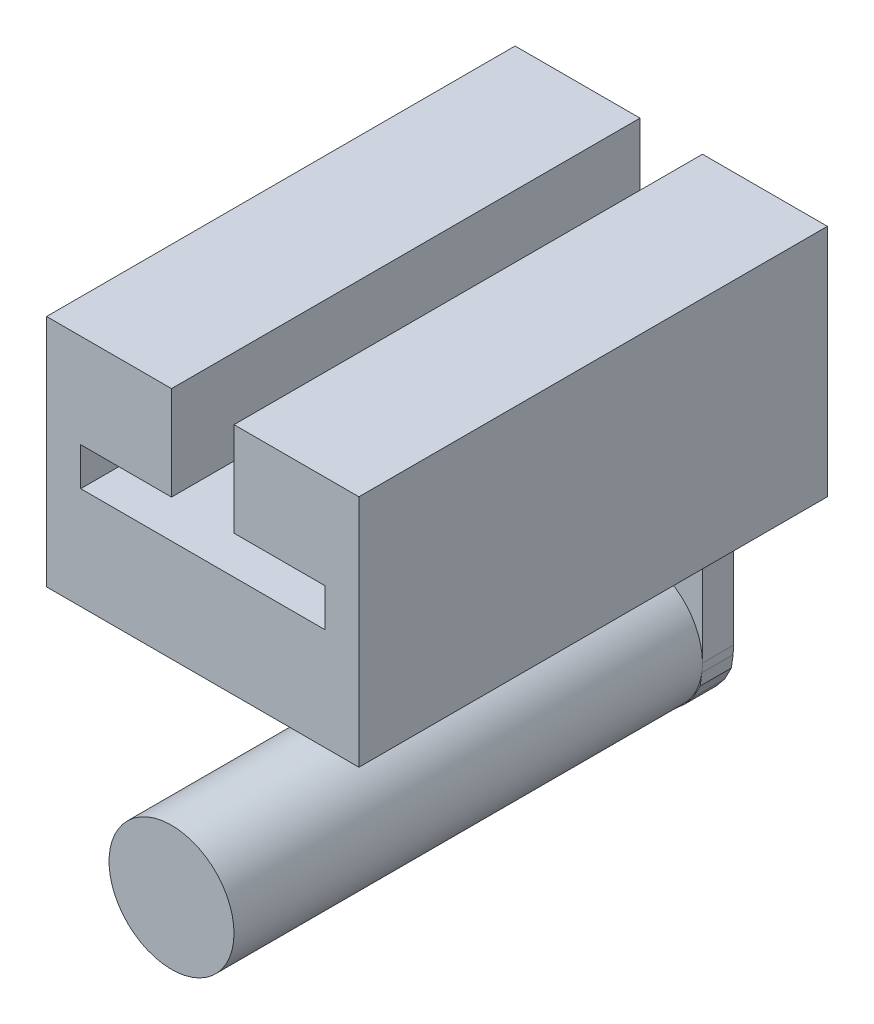
ISO-10303-21;
HEADER;
FILE_DESCRIPTION(('STEP AP214'),'2;1');
FILE_NAME('part.step','',(''),(''),'','','');
FILE_SCHEMA(('AUTOMOTIVE_DESIGN { 1 0 10303 214 1 1 1 1 }'));
ENDSEC;
DATA;
#1=APPLICATION_CONTEXT('core data for automotive mechanical design processes');
#2=APPLICATION_PROTOCOL_DEFINITION('international standard','automotive_design',2000,#1);
#3=PRODUCT_CONTEXT('',#1,'mechanical');
#4=PRODUCT('Part','Part','',(#3));
#5=PRODUCT_RELATED_PRODUCT_CATEGORY('part','',(#4));
#6=PRODUCT_DEFINITION_FORMATION('','',#4);
#7=PRODUCT_DEFINITION_CONTEXT('part definition',#1,'design');
#8=PRODUCT_DEFINITION('design','',#6,#7);
#9=PRODUCT_DEFINITION_SHAPE('','',#8);
#10=(LENGTH_UNIT() NAMED_UNIT(*) SI_UNIT(.MILLI.,.METRE.));
#11=(NAMED_UNIT(*) PLANE_ANGLE_UNIT() SI_UNIT($,.RADIAN.));
#12=(NAMED_UNIT(*) SI_UNIT($,.STERADIAN.) SOLID_ANGLE_UNIT());
#13=UNCERTAINTY_MEASURE_WITH_UNIT(LENGTH_MEASURE(1.E-05),#10,'distance_accuracy_value','');
#14=(GEOMETRIC_REPRESENTATION_CONTEXT(3) GLOBAL_UNCERTAINTY_ASSIGNED_CONTEXT((#13)) GLOBAL_UNIT_ASSIGNED_CONTEXT((#10,
#11,#12)) REPRESENTATION_CONTEXT('',''));
#15=CARTESIAN_POINT('',(0.,0.,0.));
#16=DIRECTION('',(0.,0.,1.));
#17=DIRECTION('',(1.,0.,0.));
#18=AXIS2_PLACEMENT_3D('',#15,#16,#17);
#19=CARTESIAN_POINT('',(0.,-38.1,0.));
#20=DIRECTION('',(0.,1.,0.));
#21=DIRECTION('',(0.,0.,1.));
#22=AXIS2_PLACEMENT_3D('',#19,#20,#21);
#23=PLANE('',#22);
#24=DIRECTION('',(0.,0.,1.));
#25=VECTOR('',#24,1.);
#26=CARTESIAN_POINT('',(-14.3445373438355,-38.1,-38.101025));
#27=LINE('',#26,#25);
#28=CARTESIAN_POINT('',(-14.3445373438355,-38.1,-38.1));
#29=VERTEX_POINT('',#28);
#30=CARTESIAN_POINT('',(-14.3445373438355,-38.1,-35.56));
#31=VERTEX_POINT('',#30);
#32=EDGE_CURVE('E246',#29,#31,#27,.T.);
#33=ORIENTED_EDGE('',*,*,#32,.F.);
#34=DIRECTION('',(1.,0.,0.));
#35=VECTOR('',#34,1.);
#36=CARTESIAN_POINT('',(-17.78,-38.1,-38.1));
#37=LINE('',#36,#35);
#38=CARTESIAN_POINT('',(-11.0554626561645,-38.1,-38.1));
#39=VERTEX_POINT('',#38);
#40=EDGE_CURVE('E259',#29,#39,#37,.T.);
#41=ORIENTED_EDGE('',*,*,#40,.T.);
#42=DIRECTION('',(0.,0.,1.));
#43=VECTOR('',#42,1.);
#44=CARTESIAN_POINT('',(-11.0554626561645,-38.1,-38.101));
#45=LINE('',#44,#43);
#46=CARTESIAN_POINT('',(-11.0554626561645,-38.1,-35.56));
#47=VERTEX_POINT('',#46);
#48=EDGE_CURVE('E405',#39,#47,#45,.T.);
#49=ORIENTED_EDGE('',*,*,#48,.T.);
#50=DIRECTION('',(-1.,0.,0.));
#51=VECTOR('',#50,1.);
#52=CARTESIAN_POINT('',(-17.78,-38.1,-35.56));
#53=LINE('',#52,#51);
#54=EDGE_CURVE('E265',#47,#31,#53,.T.);
#55=ORIENTED_EDGE('',*,*,#54,.T.);
#56=EDGE_LOOP('',(#33,#41,#49,#55));
#57=FACE_BOUND('',#56,.T.);
#58=ADVANCED_FACE('F47',(#57),#23,.F.);
#59=CARTESIAN_POINT('',(-25.4,0.,-38.1));
#60=DIRECTION('',(0.,0.,-1.));
#61=DIRECTION('',(-1.,0.,0.));
#62=AXIS2_PLACEMENT_3D('',#59,#60,#61);
#63=PLANE('',#62);
#64=DIRECTION('',(-0.370631758396947,0.928779898397671,0.));
#65=VECTOR('',#64,1.);
#66=CARTESIAN_POINT('',(-17.5056762409056,-34.9403341471908,-38.1));
#67=LINE('',#66,#65);
#68=CARTESIAN_POINT('',(-17.2038154332679,-35.6967783641156,-38.1));
#69=VERTEX_POINT('',#68);
#70=CARTESIAN_POINT('',(-17.6791524726972,-34.5056136104654,-38.1));
#71=VERTEX_POINT('',#70);
#72=EDGE_CURVE('E712',#69,#71,#67,.T.);
#73=ORIENTED_EDGE('',*,*,#72,.T.);
#74=DIRECTION('',(-0.0829171097609056,0.996556447427289,0.));
#75=VECTOR('',#74,1.);
#76=CARTESIAN_POINT('',(-17.6791524726972,-34.5056136104654,-38.1));
#77=LINE('',#76,#75);
#78=CARTESIAN_POINT('',(-17.78,-33.2935567282313,-38.1));
#79=VERTEX_POINT('',#78);
#80=EDGE_CURVE('E679',#71,#79,#77,.T.);
#81=ORIENTED_EDGE('',*,*,#80,.T.);
#82=DIRECTION('',(0.,1.,0.));
#83=VECTOR('',#82,1.);
#84=CARTESIAN_POINT('',(-17.78,-38.1,-38.1));
#85=LINE('',#84,#83);
#86=CARTESIAN_POINT('',(-17.78,-19.05,-38.1));
#87=VERTEX_POINT('',#86);
#88=EDGE_CURVE('E522',#79,#87,#85,.T.);
#89=ORIENTED_EDGE('',*,*,#88,.T.);
#90=DIRECTION('',(1.,0.,0.));
#91=VECTOR('',#90,1.);
#92=CARTESIAN_POINT('',(-25.4,-19.05,-38.1));
#93=LINE('',#92,#91);
#94=CARTESIAN_POINT('',(-25.4,-19.05,-38.1));
#95=VERTEX_POINT('',#94);
#96=EDGE_CURVE('E511',#95,#87,#93,.T.);
#97=ORIENTED_EDGE('',*,*,#96,.F.);
#98=DIRECTION('',(0.,1.,0.));
#99=VECTOR('',#98,1.);
#100=CARTESIAN_POINT('',(-25.4,0.,-38.1));
#101=LINE('',#100,#99);
#102=CARTESIAN_POINT('',(-25.4,0.,-38.1));
#103=VERTEX_POINT('',#102);
#104=EDGE_CURVE('E619',#95,#103,#101,.T.);
#105=ORIENTED_EDGE('',*,*,#104,.T.);
#106=DIRECTION('',(1.,0.,0.));
#107=VECTOR('',#106,1.);
#108=CARTESIAN_POINT('',(-25.4,0.,-38.1));
#109=LINE('',#108,#107);
#110=CARTESIAN_POINT('',(-15.24,0.,-38.1));
#111=VERTEX_POINT('',#110);
#112=EDGE_CURVE('E643',#103,#111,#109,.T.);
#113=ORIENTED_EDGE('',*,*,#112,.T.);
#114=DIRECTION('',(0.,-1.,0.));
#115=VECTOR('',#114,1.);
#116=CARTESIAN_POINT('',(-15.24,0.,-38.1));
#117=LINE('',#116,#115);
#118=CARTESIAN_POINT('',(-15.24,-7.64301163766851,-38.1));
#119=VERTEX_POINT('',#118);
#120=EDGE_CURVE('E533',#111,#119,#117,.T.);
#121=ORIENTED_EDGE('',*,*,#120,.T.);
#122=DIRECTION('',(-1.,0.,0.));
#123=VECTOR('',#122,1.);
#124=CARTESIAN_POINT('',(-15.24,-7.64301163766851,-38.1));
#125=LINE('',#124,#123);
#126=CARTESIAN_POINT('',(-22.6260142007384,-7.64301163766851,-38.1));
#127=VERTEX_POINT('',#126);
#128=EDGE_CURVE('E532',#119,#127,#125,.T.);
#129=ORIENTED_EDGE('',*,*,#128,.T.);
#130=DIRECTION('',(0.,-1.,0.));
#131=VECTOR('',#130,1.);
#132=CARTESIAN_POINT('',(-22.6260142007384,-7.64301163766851,-38.1));
#133=LINE('',#132,#131);
#134=CARTESIAN_POINT('',(-22.6260142007384,-10.7418116376685,-38.1));
#135=VERTEX_POINT('',#134);
#136=EDGE_CURVE('E539',#127,#135,#133,.T.);
#137=ORIENTED_EDGE('',*,*,#136,.T.);
#138=DIRECTION('',(1.,0.,0.));
#139=VECTOR('',#138,1.);
#140=CARTESIAN_POINT('',(-2.77398579926159,-10.7418116376685,-38.1));
#141=LINE('',#140,#139);
#142=CARTESIAN_POINT('',(-2.77398579926159,-10.7418116376685,-38.1));
#143=VERTEX_POINT('',#142);
#144=EDGE_CURVE('E542',#135,#143,#141,.T.);
#145=ORIENTED_EDGE('',*,*,#144,.T.);
#146=DIRECTION('',(0.,1.,0.));
#147=VECTOR('',#146,1.);
#148=CARTESIAN_POINT('',(-2.77398579926159,-7.6430116376685,-38.1));
#149=LINE('',#148,#147);
#150=CARTESIAN_POINT('',(-2.77398579926159,-7.6430116376685,-38.1));
#151=VERTEX_POINT('',#150);
#152=EDGE_CURVE('E547',#143,#151,#149,.T.);
#153=ORIENTED_EDGE('',*,*,#152,.T.);
#154=DIRECTION('',(-1.,0.,0.));
#155=VECTOR('',#154,1.);
#156=CARTESIAN_POINT('',(-10.16,-7.6430116376685,-38.1));
#157=LINE('',#156,#155);
#158=CARTESIAN_POINT('',(-10.16,-7.6430116376685,-38.1));
#159=VERTEX_POINT('',#158);
#160=EDGE_CURVE('E555',#151,#159,#157,.T.);
#161=ORIENTED_EDGE('',*,*,#160,.T.);
#162=DIRECTION('',(0.,1.,0.));
#163=VECTOR('',#162,1.);
#164=CARTESIAN_POINT('',(-10.16,0.,-38.1));
#165=LINE('',#164,#163);
#166=CARTESIAN_POINT('',(-10.16,0.,-38.1));
#167=VERTEX_POINT('',#166);
#168=EDGE_CURVE('E557',#159,#167,#165,.T.);
#169=ORIENTED_EDGE('',*,*,#168,.T.);
#170=CARTESIAN_POINT('',(0.,0.,-38.1));
#171=VERTEX_POINT('',#170);
#172=EDGE_CURVE('E644',#167,#171,#109,.T.);
#173=ORIENTED_EDGE('',*,*,#172,.T.);
#174=DIRECTION('',(0.,1.,0.));
#175=VECTOR('',#174,1.);
#176=CARTESIAN_POINT('',(0.,0.,-38.1));
#177=LINE('',#176,#175);
#178=CARTESIAN_POINT('',(0.,-19.05,-38.1));
#179=VERTEX_POINT('',#178);
#180=EDGE_CURVE('E632',#179,#171,#177,.T.);
#181=ORIENTED_EDGE('',*,*,#180,.F.);
#182=CARTESIAN_POINT('',(-7.62,-19.05,-38.1));
#183=VERTEX_POINT('',#182);
#184=EDGE_CURVE('E646',#183,#179,#93,.T.);
#185=ORIENTED_EDGE('',*,*,#184,.F.);
#186=DIRECTION('',(0.,1.,0.));
#187=VECTOR('',#186,1.);
#188=CARTESIAN_POINT('',(-7.62,-38.1,-38.1));
#189=LINE('',#188,#187);
#190=CARTESIAN_POINT('',(-7.62,-33.2935567282313,-38.1));
#191=VERTEX_POINT('',#190);
#192=EDGE_CURVE('E516',#191,#183,#189,.T.);
#193=ORIENTED_EDGE('',*,*,#192,.F.);
#194=DIRECTION('',(-0.0702766361286988,-0.997527540679672,0.));
#195=VECTOR('',#194,1.);
#196=CARTESIAN_POINT('',(-7.61999999999999,-33.2935567282313,-38.1));
#197=LINE('',#196,#195);
#198=CARTESIAN_POINT('',(-7.67017826474934,-34.005801989079,-38.1));
#199=VERTEX_POINT('',#198);
#200=EDGE_CURVE('E986',#191,#199,#197,.T.);
#201=ORIENTED_EDGE('',*,*,#200,.T.);
#202=DIRECTION('',(-0.136612503361658,-0.990624562548931,0.));
#203=VECTOR('',#202,1.);
#204=CARTESIAN_POINT('',(-7.67017826474934,-34.005801989079,-38.1));
#205=LINE('',#204,#203);
#206=CARTESIAN_POINT('',(-7.80923888003215,-35.0141786588019,-38.1));
#207=VERTEX_POINT('',#206);
#208=EDGE_CURVE('E393',#199,#207,#205,.T.);
#209=ORIENTED_EDGE('',*,*,#208,.T.);
#210=DIRECTION('',(-0.461415650910825,-0.887184082980832,0.));
#211=VECTOR('',#210,1.);
#212=CARTESIAN_POINT('',(-7.80923888003215,-35.0141786588019,-38.1));
#213=LINE('',#212,#211);
#214=CARTESIAN_POINT('',(-8.35973167226811,-36.0726352631744,-38.1));
#215=VERTEX_POINT('',#214);
#216=EDGE_CURVE('E326',#207,#215,#213,.T.);
#217=ORIENTED_EDGE('',*,*,#216,.T.);
#218=DIRECTION('',(-0.635711496565143,-0.771926740782379,0.));
#219=VECTOR('',#218,1.);
#220=CARTESIAN_POINT('',(-8.35973167226811,-36.0726352631744,-38.1));
#221=LINE('',#220,#219);
#222=CARTESIAN_POINT('',(-9.02180364123595,-36.8765707904224,-38.1));
#223=VERTEX_POINT('',#222);
#224=EDGE_CURVE('E1028',#215,#223,#221,.T.);
#225=ORIENTED_EDGE('',*,*,#224,.T.);
#226=DIRECTION('',(-0.739417062071894,-0.673247657490889,0.));
#227=VECTOR('',#226,1.);
#228=CARTESIAN_POINT('',(-9.02180364123595,-36.8765707904224,-38.1));
#229=LINE('',#228,#227);
#230=CARTESIAN_POINT('',(-9.85741699767928,-37.6374062696812,-38.1));
#231=VERTEX_POINT('',#230);
#232=EDGE_CURVE('E1029',#223,#231,#229,.T.);
#233=ORIENTED_EDGE('',*,*,#232,.T.);
#234=DIRECTION('',(-0.932873385373654,-0.360204451473741,0.));
#235=VECTOR('',#234,1.);
#236=CARTESIAN_POINT('',(-9.85741699767928,-37.6374062696812,-38.1));
#237=LINE('',#236,#235);
#238=EDGE_CURVE('E271',#231,#39,#237,.T.);
#239=ORIENTED_EDGE('',*,*,#238,.T.);
#240=ORIENTED_EDGE('',*,*,#40,.F.);
#241=DIRECTION('',(-0.955155109451087,0.296105921739977,0.));
#242=VECTOR('',#241,1.);
#243=CARTESIAN_POINT('',(-14.3445373438355,-38.1,-38.1));
#244=LINE('',#243,#242);
#245=CARTESIAN_POINT('',(-15.7622179131125,-37.6605073903234,-38.1));
#246=VERTEX_POINT('',#245);
#247=EDGE_CURVE('E241',#29,#246,#244,.T.);
#248=ORIENTED_EDGE('',*,*,#247,.T.);
#249=DIRECTION('',(-0.617078696406372,0.786901443918749,0.));
#250=VECTOR('',#249,1.);
#251=CARTESIAN_POINT('',(-15.7622179131125,-37.6605073903234,-38.1));
#252=LINE('',#251,#250);
#253=CARTESIAN_POINT('',(-16.7477395777562,-36.4037658670175,-38.1));
#254=VERTEX_POINT('',#253);
#255=EDGE_CURVE('E255',#246,#254,#252,.T.);
#256=ORIENTED_EDGE('',*,*,#255,.T.);
#257=DIRECTION('',(-0.542089006613399,0.840321074892745,0.));
#258=VECTOR('',#257,1.);
#259=CARTESIAN_POINT('',(-16.7477395777562,-36.4037658670175,-38.1));
#260=LINE('',#259,#258);
#261=EDGE_CURVE('E717',#254,#69,#260,.T.);
#262=ORIENTED_EDGE('',*,*,#261,.T.);
#263=EDGE_LOOP('',(#73,#81,#89,#97,#105,#113,#121,#129,#137,#145,#153,#161,#169,#173,#181,#185,
#193,#201,#209,#217,#225,#233,#239,#240,#248,#256,#262));
#264=FACE_BOUND('',#263,.T.);
#265=ADVANCED_FACE('F267',(#264),#63,.T.);
#266=CARTESIAN_POINT('',(-17.78,-38.1,-35.56));
#267=DIRECTION('',(0.,0.,-1.));
#268=DIRECTION('',(-1.,0.,0.));
#269=AXIS2_PLACEMENT_3D('',#266,#267,#268);
#270=PLANE('',#269);
#271=DIRECTION('',(-0.955155109451088,0.296105921739977,0.));
#272=VECTOR('',#271,1.);
#273=CARTESIAN_POINT('',(-14.3445373438355,-38.1,-35.56));
#274=LINE('',#273,#272);
#275=CARTESIAN_POINT('',(-15.7622179131125,-37.6605073903234,-35.56));
#276=VERTEX_POINT('',#275);
#277=EDGE_CURVE('E68',#31,#276,#274,.T.);
#278=ORIENTED_EDGE('',*,*,#277,.F.);
#279=CARTESIAN_POINT('',(-12.7,-33.2935567282313,-35.56));
#280=DIRECTION('',(0.,0.,1.));
#281=DIRECTION('',(1.,0.,0.));
#282=AXIS2_PLACEMENT_3D('',#279,#280,#281);
#283=CIRCLE('',#282,5.08);
#284=CARTESIAN_POINT('',(-17.3191428574413,-35.4077750855798,-35.56));
#285=VERTEX_POINT('',#284);
#286=EDGE_CURVE('E52',#285,#31,#283,.T.);
#287=ORIENTED_EDGE('',*,*,#286,.F.);
#288=DIRECTION('',(-0.370631758396947,0.928779898397671,0.));
#289=VECTOR('',#288,1.);
#290=CARTESIAN_POINT('',(-17.5056762409056,-34.9403341471908,-35.56));
#291=LINE('',#290,#289);
#292=CARTESIAN_POINT('',(-17.2038154332679,-35.6967783641156,-35.56));
#293=VERTEX_POINT('',#292);
#294=EDGE_CURVE('E312',#293,#285,#291,.T.);
#295=ORIENTED_EDGE('',*,*,#294,.F.);
#296=DIRECTION('',(-0.542089006613399,0.840321074892745,0.));
#297=VECTOR('',#296,1.);
#298=CARTESIAN_POINT('',(-16.7477395777562,-36.4037658670175,-35.56));
#299=LINE('',#298,#297);
#300=CARTESIAN_POINT('',(-16.7477395777562,-36.4037658670175,-35.56));
#301=VERTEX_POINT('',#300);
#302=EDGE_CURVE('E698',#301,#293,#299,.T.);
#303=ORIENTED_EDGE('',*,*,#302,.F.);
#304=DIRECTION('',(-0.617078696406372,0.786901443918749,0.));
#305=VECTOR('',#304,1.);
#306=CARTESIAN_POINT('',(-15.7622179131125,-37.6605073903234,-35.56));
#307=LINE('',#306,#305);
#308=EDGE_CURVE('E697',#276,#301,#307,.T.);
#309=ORIENTED_EDGE('',*,*,#308,.F.);
#310=EDGE_LOOP('',(#278,#287,#295,#303,#309));
#311=FACE_BOUND('',#310,.T.);
#312=ADVANCED_FACE('F453',(#311),#270,.F.);
#313=DIRECTION('',(-0.0829171097609056,0.996556447427289,0.));
#314=VECTOR('',#313,1.);
#315=CARTESIAN_POINT('',(-17.6791524726972,-34.5056136104654,-35.56));
#316=LINE('',#315,#314);
#317=CARTESIAN_POINT('',(-17.6791524726972,-34.5056136104654,-35.56));
#318=VERTEX_POINT('',#317);
#319=CARTESIAN_POINT('',(-17.7101474895544,-34.1330935844275,-35.56));
#320=VERTEX_POINT('',#319);
#321=EDGE_CURVE('E706',#318,#320,#316,.T.);
#322=ORIENTED_EDGE('',*,*,#321,.F.);
#323=CARTESIAN_POINT('',(-17.5056762409056,-34.9403341471908,-35.56));
#324=VERTEX_POINT('',#323);
#325=EDGE_CURVE('E315',#324,#318,#291,.T.);
#326=ORIENTED_EDGE('',*,*,#325,.F.);
#327=EDGE_CURVE('E392',#320,#324,#283,.T.);
#328=ORIENTED_EDGE('',*,*,#327,.F.);
#329=EDGE_LOOP('',(#322,#326,#328));
#330=FACE_BOUND('',#329,.T.);
#331=ADVANCED_FACE('F457',(#330),#270,.F.);
#332=CARTESIAN_POINT('',(-7.62,-38.1,-38.1));
#333=DIRECTION('',(-1.,0.,0.));
#334=DIRECTION('',(0.,0.,1.));
#335=AXIS2_PLACEMENT_3D('',#332,#333,#334);
#336=PLANE('',#335);
#337=DIRECTION('',(0.,0.,1.));
#338=VECTOR('',#337,1.);
#339=CARTESIAN_POINT('',(-7.61999999999999,-33.2935567282313,-38.101));
#340=LINE('',#339,#338);
#341=CARTESIAN_POINT('',(-7.61999999999999,-33.2935567282313,-35.56));
#342=VERTEX_POINT('',#341);
#343=EDGE_CURVE('E400',#191,#342,#340,.T.);
#344=ORIENTED_EDGE('',*,*,#343,.F.);
#345=ORIENTED_EDGE('',*,*,#192,.T.);
#346=DIRECTION('',(0.,0.,1.));
#347=VECTOR('',#346,1.);
#348=CARTESIAN_POINT('',(-7.62,-19.05,-38.1));
#349=LINE('',#348,#347);
#350=CARTESIAN_POINT('',(-7.62,-19.05,-35.56));
#351=VERTEX_POINT('',#350);
#352=EDGE_CURVE('E278',#183,#351,#349,.T.);
#353=ORIENTED_EDGE('',*,*,#352,.T.);
#354=DIRECTION('',(0.,1.,0.));
#355=VECTOR('',#354,1.);
#356=CARTESIAN_POINT('',(-7.62,-38.1,-35.56));
#357=LINE('',#356,#355);
#358=EDGE_CURVE('E520',#342,#351,#357,.T.);
#359=ORIENTED_EDGE('',*,*,#358,.F.);
#360=EDGE_LOOP('',(#344,#345,#353,#359));
#361=FACE_BOUND('',#360,.T.);
#362=ADVANCED_FACE('F452',(#361),#336,.F.);
#363=DIRECTION('',(-0.932873385373654,-0.360204451473741,0.));
#364=VECTOR('',#363,1.);
#365=CARTESIAN_POINT('',(-9.85741699767928,-37.6374062696812,-35.56));
#366=LINE('',#365,#364);
#367=CARTESIAN_POINT('',(-9.85741699767928,-37.6374062696812,-35.56));
#368=VERTEX_POINT('',#367);
#369=CARTESIAN_POINT('',(-10.6876173534133,-37.9579662389536,-35.56));
#370=VERTEX_POINT('',#369);
#371=EDGE_CURVE('E413',#368,#370,#366,.T.);
#372=ORIENTED_EDGE('',*,*,#371,.F.);
#373=DIRECTION('',(-0.739417062071894,-0.673247657490889,0.));
#374=VECTOR('',#373,1.);
#375=CARTESIAN_POINT('',(-9.02180364123595,-36.8765707904224,-35.56));
#376=LINE('',#375,#374);
#377=CARTESIAN_POINT('',(-9.02180364123595,-36.8765707904224,-35.56));
#378=VERTEX_POINT('',#377);
#379=EDGE_CURVE('E1004',#378,#368,#376,.T.);
#380=ORIENTED_EDGE('',*,*,#379,.F.);
#381=DIRECTION('',(-0.635711496565143,-0.771926740782379,0.));
#382=VECTOR('',#381,1.);
#383=CARTESIAN_POINT('',(-8.35973167226811,-36.0726352631744,-35.56));
#384=LINE('',#383,#382);
#385=CARTESIAN_POINT('',(-8.35973167226811,-36.0726352631744,-35.56));
#386=VERTEX_POINT('',#385);
#387=EDGE_CURVE('E996',#386,#378,#384,.T.);
#388=ORIENTED_EDGE('',*,*,#387,.F.);
#389=DIRECTION('',(-0.461415650910824,-0.887184082980832,0.));
#390=VECTOR('',#389,1.);
#391=CARTESIAN_POINT('',(-7.80923888003215,-35.0141786588019,-35.56));
#392=LINE('',#391,#390);
#393=CARTESIAN_POINT('',(-7.80923888003215,-35.0141786588019,-35.56));
#394=VERTEX_POINT('',#393);
#395=EDGE_CURVE('E995',#394,#386,#392,.T.);
#396=ORIENTED_EDGE('',*,*,#395,.F.);
#397=DIRECTION('',(-0.136612503361658,-0.990624562548931,0.));
#398=VECTOR('',#397,1.);
#399=CARTESIAN_POINT('',(-7.67017826474934,-34.005801989079,-35.56));
#400=LINE('',#399,#398);
#401=CARTESIAN_POINT('',(-7.67017826474934,-34.005801989079,-35.56));
#402=VERTEX_POINT('',#401);
#403=EDGE_CURVE('E77',#402,#394,#400,.T.);
#404=ORIENTED_EDGE('',*,*,#403,.F.);
#405=EDGE_CURVE('E303',#370,#402,#283,.T.);
#406=ORIENTED_EDGE('',*,*,#405,.F.);
#407=EDGE_LOOP('',(#372,#380,#388,#396,#404,#406));
#408=FACE_BOUND('',#407,.T.);
#409=ADVANCED_FACE('F450',(#408),#270,.F.);
#410=CARTESIAN_POINT('',(-17.78,-33.2935567282313,-35.56));
#411=VERTEX_POINT('',#410);
#412=EDGE_CURVE('E283',#342,#411,#283,.T.);
#413=ORIENTED_EDGE('',*,*,#412,.F.);
#414=ORIENTED_EDGE('',*,*,#358,.T.);
#415=DIRECTION('',(-1.,0.,0.));
#416=VECTOR('',#415,1.);
#417=CARTESIAN_POINT('',(-17.78,-19.05,-35.56));
#418=LINE('',#417,#416);
#419=CARTESIAN_POINT('',(-17.78,-19.05,-35.56));
#420=VERTEX_POINT('',#419);
#421=EDGE_CURVE('E272',#351,#420,#418,.T.);
#422=ORIENTED_EDGE('',*,*,#421,.T.);
#423=DIRECTION('',(0.,1.,0.));
#424=VECTOR('',#423,1.);
#425=CARTESIAN_POINT('',(-17.78,-38.1,-35.56));
#426=LINE('',#425,#424);
#427=EDGE_CURVE('E280',#411,#420,#426,.T.);
#428=ORIENTED_EDGE('',*,*,#427,.F.);
#429=EDGE_LOOP('',(#413,#414,#422,#428));
#430=FACE_BOUND('',#429,.T.);
#431=ADVANCED_FACE('F446',(#430),#270,.F.);
#432=CARTESIAN_POINT('',(-25.4,0.,0.));
#433=DIRECTION('',(0.,1.,0.));
#434=DIRECTION('',(0.,0.,1.));
#435=AXIS2_PLACEMENT_3D('',#432,#433,#434);
#436=PLANE('',#435);
#437=ORIENTED_EDGE('',*,*,#172,.F.);
#438=DIRECTION('',(0.,0.,1.));
#439=VECTOR('',#438,1.);
#440=CARTESIAN_POINT('',(-10.16,0.,-38.1));
#441=LINE('',#440,#439);
#442=CARTESIAN_POINT('',(-10.16,0.,0.));
#443=VERTEX_POINT('',#442);
#444=EDGE_CURVE('E588',#167,#443,#441,.T.);
#445=ORIENTED_EDGE('',*,*,#444,.T.);
#446=DIRECTION('',(1.,0.,0.));
#447=VECTOR('',#446,1.);
#448=CARTESIAN_POINT('',(-25.4,0.,0.));
#449=LINE('',#448,#447);
#450=CARTESIAN_POINT('',(0.,0.,0.));
#451=VERTEX_POINT('',#450);
#452=EDGE_CURVE('E58',#443,#451,#449,.T.);
#453=ORIENTED_EDGE('',*,*,#452,.T.);
#454=DIRECTION('',(0.,0.,1.));
#455=VECTOR('',#454,1.);
#456=CARTESIAN_POINT('',(0.,0.,0.));
#457=LINE('',#456,#455);
#458=EDGE_CURVE('E617',#171,#451,#457,.T.);
#459=ORIENTED_EDGE('',*,*,#458,.F.);
#460=EDGE_LOOP('',(#437,#445,#453,#459));
#461=FACE_BOUND('',#460,.T.);
#462=ADVANCED_FACE('F505',(#461),#436,.T.);
#463=CARTESIAN_POINT('',(-25.4,0.,0.));
#464=DIRECTION('',(0.,0.,1.));
#465=DIRECTION('',(0.,-1.,0.));
#466=AXIS2_PLACEMENT_3D('',#463,#464,#465);
#467=PLANE('',#466);
#468=DIRECTION('',(0.,-1.,0.));
#469=VECTOR('',#468,1.);
#470=CARTESIAN_POINT('',(-15.24,0.,0.));
#471=LINE('',#470,#469);
#472=CARTESIAN_POINT('',(-15.24,0.,0.));
#473=VERTEX_POINT('',#472);
#474=CARTESIAN_POINT('',(-15.24,-7.64301163766851,0.));
#475=VERTEX_POINT('',#474);
#476=EDGE_CURVE('E529',#473,#475,#471,.T.);
#477=ORIENTED_EDGE('',*,*,#476,.F.);
#478=CARTESIAN_POINT('',(-25.4,0.,0.));
#479=VERTEX_POINT('',#478);
#480=EDGE_CURVE('E11',#479,#473,#449,.T.);
#481=ORIENTED_EDGE('',*,*,#480,.F.);
#482=DIRECTION('',(0.,-1.,0.));
#483=VECTOR('',#482,1.);
#484=CARTESIAN_POINT('',(-25.4,0.,0.));
#485=LINE('',#484,#483);
#486=CARTESIAN_POINT('',(-25.4,-19.05,0.));
#487=VERTEX_POINT('',#486);
#488=EDGE_CURVE('E612',#479,#487,#485,.T.);
#489=ORIENTED_EDGE('',*,*,#488,.T.);
#490=DIRECTION('',(1.,0.,0.));
#491=VECTOR('',#490,1.);
#492=CARTESIAN_POINT('',(-25.4,-19.05,0.));
#493=LINE('',#492,#491);
#494=CARTESIAN_POINT('',(0.,-19.05,0.));
#495=VERTEX_POINT('',#494);
#496=EDGE_CURVE('E414',#487,#495,#493,.T.);
#497=ORIENTED_EDGE('',*,*,#496,.T.);
#498=DIRECTION('',(0.,-1.,0.));
#499=VECTOR('',#498,1.);
#500=CARTESIAN_POINT('',(0.,0.,0.));
#501=LINE('',#500,#499);
#502=EDGE_CURVE('E587',#451,#495,#501,.T.);
#503=ORIENTED_EDGE('',*,*,#502,.F.);
#504=ORIENTED_EDGE('',*,*,#452,.F.);
#505=DIRECTION('',(0.,1.,0.));
#506=VECTOR('',#505,1.);
#507=CARTESIAN_POINT('',(-10.16,0.,0.));
#508=LINE('',#507,#506);
#509=CARTESIAN_POINT('',(-10.16,-7.6430116376685,0.));
#510=VERTEX_POINT('',#509);
#511=EDGE_CURVE('E536',#510,#443,#508,.T.);
#512=ORIENTED_EDGE('',*,*,#511,.F.);
#513=DIRECTION('',(-1.,0.,0.));
#514=VECTOR('',#513,1.);
#515=CARTESIAN_POINT('',(-10.16,-7.6430116376685,0.));
#516=LINE('',#515,#514);
#517=CARTESIAN_POINT('',(-2.77398579926159,-7.6430116376685,0.));
#518=VERTEX_POINT('',#517);
#519=EDGE_CURVE('E579',#518,#510,#516,.T.);
#520=ORIENTED_EDGE('',*,*,#519,.F.);
#521=DIRECTION('',(0.,1.,0.));
#522=VECTOR('',#521,1.);
#523=CARTESIAN_POINT('',(-2.77398579926159,-7.6430116376685,0.));
#524=LINE('',#523,#522);
#525=CARTESIAN_POINT('',(-2.77398579926159,-10.7418116376685,0.));
#526=VERTEX_POINT('',#525);
#527=EDGE_CURVE('E578',#526,#518,#524,.T.);
#528=ORIENTED_EDGE('',*,*,#527,.F.);
#529=DIRECTION('',(1.,0.,0.));
#530=VECTOR('',#529,1.);
#531=CARTESIAN_POINT('',(-2.77398579926159,-10.7418116376685,0.));
#532=LINE('',#531,#530);
#533=CARTESIAN_POINT('',(-22.6260142007384,-10.7418116376685,0.));
#534=VERTEX_POINT('',#533);
#535=EDGE_CURVE('E575',#534,#526,#532,.T.);
#536=ORIENTED_EDGE('',*,*,#535,.F.);
#537=DIRECTION('',(0.,-1.,0.));
#538=VECTOR('',#537,1.);
#539=CARTESIAN_POINT('',(-22.6260142007384,-7.64301163766851,0.));
#540=LINE('',#539,#538);
#541=CARTESIAN_POINT('',(-22.6260142007384,-7.64301163766851,0.));
#542=VERTEX_POINT('',#541);
#543=EDGE_CURVE('E566',#542,#534,#540,.T.);
#544=ORIENTED_EDGE('',*,*,#543,.F.);
#545=DIRECTION('',(-1.,0.,0.));
#546=VECTOR('',#545,1.);
#547=CARTESIAN_POINT('',(-15.24,-7.64301163766851,0.));
#548=LINE('',#547,#546);
#549=EDGE_CURVE('E564',#475,#542,#548,.T.);
#550=ORIENTED_EDGE('',*,*,#549,.F.);
#551=EDGE_LOOP('',(#477,#481,#489,#497,#503,#504,#512,#520,#528,#536,#544,#550));
#552=FACE_BOUND('',#551,.T.);
#553=ADVANCED_FACE('F51',(#552),#467,.T.);
#554=DIRECTION('',(0.,0.,1.));
#555=VECTOR('',#554,1.);
#556=CARTESIAN_POINT('',(-15.24,0.,-38.1));
#557=LINE('',#556,#555);
#558=EDGE_CURVE('E556',#111,#473,#557,.T.);
#559=ORIENTED_EDGE('',*,*,#558,.F.);
#560=ORIENTED_EDGE('',*,*,#112,.F.);
#561=DIRECTION('',(0.,0.,1.));
#562=VECTOR('',#561,1.);
#563=CARTESIAN_POINT('',(-25.4,0.,0.));
#564=LINE('',#563,#562);
#565=EDGE_CURVE('E621',#103,#479,#564,.T.);
#566=ORIENTED_EDGE('',*,*,#565,.T.);
#567=ORIENTED_EDGE('',*,*,#480,.T.);
#568=EDGE_LOOP('',(#559,#560,#566,#567));
#569=FACE_BOUND('',#568,.T.);
#570=ADVANCED_FACE('F499',(#569),#436,.T.);
#571=CARTESIAN_POINT('',(-25.4,-19.05,0.));
#572=DIRECTION('',(0.,-1.,0.));
#573=DIRECTION('',(0.,0.,-1.));
#574=AXIS2_PLACEMENT_3D('',#571,#572,#573);
#575=PLANE('',#574);
#576=DIRECTION('',(0.,0.,-1.));
#577=VECTOR('',#576,1.);
#578=CARTESIAN_POINT('',(-17.78,-19.05,-38.1));
#579=LINE('',#578,#577);
#580=EDGE_CURVE('E288',#420,#87,#579,.T.);
#581=ORIENTED_EDGE('',*,*,#580,.F.);
#582=ORIENTED_EDGE('',*,*,#421,.F.);
#583=ORIENTED_EDGE('',*,*,#352,.F.);
#584=ORIENTED_EDGE('',*,*,#184,.T.);
#585=DIRECTION('',(0.,0.,-1.));
#586=VECTOR('',#585,1.);
#587=CARTESIAN_POINT('',(0.,-19.05,0.));
#588=LINE('',#587,#586);
#589=EDGE_CURVE('E626',#495,#179,#588,.T.);
#590=ORIENTED_EDGE('',*,*,#589,.F.);
#591=ORIENTED_EDGE('',*,*,#496,.F.);
#592=DIRECTION('',(0.,0.,-1.));
#593=VECTOR('',#592,1.);
#594=CARTESIAN_POINT('',(-25.4,-19.05,0.));
#595=LINE('',#594,#593);
#596=EDGE_CURVE('E611',#487,#95,#595,.T.);
#597=ORIENTED_EDGE('',*,*,#596,.T.);
#598=ORIENTED_EDGE('',*,*,#96,.T.);
#599=EDGE_LOOP('',(#581,#582,#583,#584,#590,#591,#597,#598));
#600=FACE_BOUND('',#599,.T.);
#601=ADVANCED_FACE('F492',(#600),#575,.T.);
#602=CARTESIAN_POINT('',(-25.4,0.,0.));
#603=DIRECTION('',(1.,0.,0.));
#604=DIRECTION('',(0.,0.,-1.));
#605=AXIS2_PLACEMENT_3D('',#602,#603,#604);
#606=PLANE('',#605);
#607=ORIENTED_EDGE('',*,*,#488,.F.);
#608=ORIENTED_EDGE('',*,*,#565,.F.);
#609=ORIENTED_EDGE('',*,*,#104,.F.);
#610=ORIENTED_EDGE('',*,*,#596,.F.);
#611=EDGE_LOOP('',(#607,#608,#609,#610));
#612=FACE_BOUND('',#611,.T.);
#613=ADVANCED_FACE('F489',(#612),#606,.F.);
#614=CARTESIAN_POINT('',(0.,0.,0.));
#615=DIRECTION('',(1.,0.,0.));
#616=DIRECTION('',(0.,0.,-1.));
#617=AXIS2_PLACEMENT_3D('',#614,#615,#616);
#618=PLANE('',#617);
#619=ORIENTED_EDGE('',*,*,#502,.T.);
#620=ORIENTED_EDGE('',*,*,#589,.T.);
#621=ORIENTED_EDGE('',*,*,#180,.T.);
#622=ORIENTED_EDGE('',*,*,#458,.T.);
#623=EDGE_LOOP('',(#619,#620,#621,#622));
#624=FACE_BOUND('',#623,.T.);
#625=ADVANCED_FACE('F468',(#624),#618,.T.);
#626=CARTESIAN_POINT('',(-10.16,0.,-38.1));
#627=DIRECTION('',(1.,0.,0.));
#628=DIRECTION('',(0.,1.,0.));
#629=AXIS2_PLACEMENT_3D('',#626,#627,#628);
#630=PLANE('',#629);
#631=ORIENTED_EDGE('',*,*,#511,.T.);
#632=ORIENTED_EDGE('',*,*,#444,.F.);
#633=ORIENTED_EDGE('',*,*,#168,.F.);
#634=DIRECTION('',(0.,0.,1.));
#635=VECTOR('',#634,1.);
#636=CARTESIAN_POINT('',(-10.16,-7.6430116376685,-38.1));
#637=LINE('',#636,#635);
#638=EDGE_CURVE('E591',#159,#510,#637,.T.);
#639=ORIENTED_EDGE('',*,*,#638,.T.);
#640=EDGE_LOOP('',(#631,#632,#633,#639));
#641=FACE_BOUND('',#640,.T.);
#642=ADVANCED_FACE('F465',(#641),#630,.F.);
#643=CARTESIAN_POINT('',(-10.16,-7.6430116376685,-38.1));
#644=DIRECTION('',(0.,1.,0.));
#645=DIRECTION('',(0.,0.,1.));
#646=AXIS2_PLACEMENT_3D('',#643,#644,#645);
#647=PLANE('',#646);
#648=ORIENTED_EDGE('',*,*,#519,.T.);
#649=ORIENTED_EDGE('',*,*,#638,.F.);
#650=ORIENTED_EDGE('',*,*,#160,.F.);
#651=DIRECTION('',(0.,0.,1.));
#652=VECTOR('',#651,1.);
#653=CARTESIAN_POINT('',(-2.77398579926159,-7.6430116376685,-38.1));
#654=LINE('',#653,#652);
#655=EDGE_CURVE('E592',#151,#518,#654,.T.);
#656=ORIENTED_EDGE('',*,*,#655,.T.);
#657=EDGE_LOOP('',(#648,#649,#650,#656));
#658=FACE_BOUND('',#657,.T.);
#659=ADVANCED_FACE('F461',(#658),#647,.F.);
#660=CARTESIAN_POINT('',(-2.77398579926159,-7.6430116376685,-38.1));
#661=DIRECTION('',(1.,0.,0.));
#662=DIRECTION('',(0.,0.,-1.));
#663=AXIS2_PLACEMENT_3D('',#660,#661,#662);
#664=PLANE('',#663);
#665=ORIENTED_EDGE('',*,*,#527,.T.);
#666=ORIENTED_EDGE('',*,*,#655,.F.);
#667=ORIENTED_EDGE('',*,*,#152,.F.);
#668=DIRECTION('',(0.,0.,1.));
#669=VECTOR('',#668,1.);
#670=CARTESIAN_POINT('',(-2.77398579926159,-10.7418116376685,-38.1));
#671=LINE('',#670,#669);
#672=EDGE_CURVE('E600',#143,#526,#671,.T.);
#673=ORIENTED_EDGE('',*,*,#672,.T.);
#674=EDGE_LOOP('',(#665,#666,#667,#673));
#675=FACE_BOUND('',#674,.T.);
#676=ADVANCED_FACE('F469',(#675),#664,.F.);
#677=CARTESIAN_POINT('',(-2.77398579926159,-10.7418116376685,-38.1));
#678=DIRECTION('',(0.,-1.,0.));
#679=DIRECTION('',(0.,0.,-1.));
#680=AXIS2_PLACEMENT_3D('',#677,#678,#679);
#681=PLANE('',#680);
#682=ORIENTED_EDGE('',*,*,#535,.T.);
#683=ORIENTED_EDGE('',*,*,#672,.F.);
#684=ORIENTED_EDGE('',*,*,#144,.F.);
#685=DIRECTION('',(0.,0.,1.));
#686=VECTOR('',#685,1.);
#687=CARTESIAN_POINT('',(-22.6260142007384,-10.7418116376685,-38.1));
#688=LINE('',#687,#686);
#689=EDGE_CURVE('E599',#135,#534,#688,.T.);
#690=ORIENTED_EDGE('',*,*,#689,.T.);
#691=EDGE_LOOP('',(#682,#683,#684,#690));
#692=FACE_BOUND('',#691,.T.);
#693=ADVANCED_FACE('F475',(#692),#681,.F.);
#694=CARTESIAN_POINT('',(-22.6260142007384,-7.64301163766851,-38.1));
#695=DIRECTION('',(-1.,0.,0.));
#696=DIRECTION('',(0.,-1.,0.));
#697=AXIS2_PLACEMENT_3D('',#694,#695,#696);
#698=PLANE('',#697);
#699=ORIENTED_EDGE('',*,*,#543,.T.);
#700=ORIENTED_EDGE('',*,*,#689,.F.);
#701=ORIENTED_EDGE('',*,*,#136,.F.);
#702=DIRECTION('',(0.,0.,1.));
#703=VECTOR('',#702,1.);
#704=CARTESIAN_POINT('',(-22.6260142007384,-7.64301163766851,-38.1));
#705=LINE('',#704,#703);
#706=EDGE_CURVE('E602',#127,#542,#705,.T.);
#707=ORIENTED_EDGE('',*,*,#706,.T.);
#708=EDGE_LOOP('',(#699,#700,#701,#707));
#709=FACE_BOUND('',#708,.T.);
#710=ADVANCED_FACE('F476',(#709),#698,.F.);
#711=CARTESIAN_POINT('',(-15.24,-7.64301163766851,-38.1));
#712=DIRECTION('',(0.,1.,0.));
#713=DIRECTION('',(-1.,0.,0.));
#714=AXIS2_PLACEMENT_3D('',#711,#712,#713);
#715=PLANE('',#714);
#716=ORIENTED_EDGE('',*,*,#549,.T.);
#717=ORIENTED_EDGE('',*,*,#706,.F.);
#718=ORIENTED_EDGE('',*,*,#128,.F.);
#719=DIRECTION('',(0.,0.,1.));
#720=VECTOR('',#719,1.);
#721=CARTESIAN_POINT('',(-15.24,-7.64301163766851,-38.1));
#722=LINE('',#721,#720);
#723=EDGE_CURVE('E607',#119,#475,#722,.T.);
#724=ORIENTED_EDGE('',*,*,#723,.T.);
#725=EDGE_LOOP('',(#716,#717,#718,#724));
#726=FACE_BOUND('',#725,.T.);
#727=ADVANCED_FACE('F485',(#726),#715,.F.);
#728=CARTESIAN_POINT('',(-15.24,0.,-38.1));
#729=DIRECTION('',(-1.,0.,0.));
#730=DIRECTION('',(0.,0.,1.));
#731=AXIS2_PLACEMENT_3D('',#728,#729,#730);
#732=PLANE('',#731);
#733=ORIENTED_EDGE('',*,*,#476,.T.);
#734=ORIENTED_EDGE('',*,*,#723,.F.);
#735=ORIENTED_EDGE('',*,*,#120,.F.);
#736=ORIENTED_EDGE('',*,*,#558,.T.);
#737=EDGE_LOOP('',(#733,#734,#735,#736));
#738=FACE_BOUND('',#737,.T.);
#739=ADVANCED_FACE('F458',(#738),#732,.F.);
#740=CARTESIAN_POINT('',(-17.78,-38.1,-38.1));
#741=DIRECTION('',(1.,0.,0.));
#742=DIRECTION('',(0.,0.,-1.));
#743=AXIS2_PLACEMENT_3D('',#740,#741,#742);
#744=PLANE('',#743);
#745=ORIENTED_EDGE('',*,*,#88,.F.);
#746=DIRECTION('',(0.,0.,1.));
#747=VECTOR('',#746,1.);
#748=CARTESIAN_POINT('',(-17.78,-33.2935567282313,-38.101025));
#749=LINE('',#748,#747);
#750=EDGE_CURVE('E264',#79,#411,#749,.T.);
#751=ORIENTED_EDGE('',*,*,#750,.T.);
#752=ORIENTED_EDGE('',*,*,#427,.T.);
#753=ORIENTED_EDGE('',*,*,#580,.T.);
#754=EDGE_LOOP('',(#745,#751,#752,#753));
#755=FACE_BOUND('',#754,.T.);
#756=ADVANCED_FACE('F439',(#755),#744,.F.);
#757=CARTESIAN_POINT('',(-12.7,-33.2935567282313,2.54));
#758=DIRECTION('',(0.,0.,-1.));
#759=DIRECTION('',(-1.,0.,0.));
#760=AXIS2_PLACEMENT_3D('',#757,#758,#759);
#761=CYLINDRICAL_SURFACE('',#760,5.08);
#762=CARTESIAN_POINT('',(-12.7,-33.2935567282313,2.54));
#763=DIRECTION('',(0.,0.,1.));
#764=DIRECTION('',(1.,0.,0.));
#765=AXIS2_PLACEMENT_3D('',#762,#763,#764);
#766=CIRCLE('',#765,5.08);
#767=CARTESIAN_POINT('',(-7.61999999999999,-33.2935567282313,2.54));
#768=VERTEX_POINT('',#767);
#769=EDGE_CURVE('E371',#768,#768,#766,.T.);
#770=ORIENTED_EDGE('',*,*,#769,.F.);
#771=EDGE_LOOP('',(#770));
#772=FACE_BOUND('',#771,.T.);
#773=ORIENTED_EDGE('',*,*,#412,.T.);
#774=EDGE_CURVE('E384',#411,#320,#283,.T.);
#775=ORIENTED_EDGE('',*,*,#774,.T.);
#776=ORIENTED_EDGE('',*,*,#327,.T.);
#777=CARTESIAN_POINT('',(-12.7,-33.2935567282313,-35.56));
#778=DIRECTION('',(0.,0.,1.));
#779=DIRECTION('',(-0.945999260020795,-0.324168783259751,0.));
#780=AXIS2_PLACEMENT_3D('',#777,#778,#779);
#781=CIRCLE('',#780,5.08);
#782=EDGE_CURVE('E319',#324,#285,#781,.T.);
#783=ORIENTED_EDGE('',*,*,#782,.T.);
#784=ORIENTED_EDGE('',*,*,#286,.T.);
#785=EDGE_CURVE('E297',#31,#47,#283,.T.);
#786=ORIENTED_EDGE('',*,*,#785,.T.);
#787=CARTESIAN_POINT('',(-12.7,-33.2935567282313,-35.56));
#788=DIRECTION('',(0.,0.,1.));
#789=DIRECTION('',(0.32372782358966,-0.946150250348168,0.));
#790=AXIS2_PLACEMENT_3D('',#787,#788,#789);
#791=CIRCLE('',#790,5.08);
#792=EDGE_CURVE('E296',#47,#370,#791,.T.);
#793=ORIENTED_EDGE('',*,*,#792,.T.);
#794=ORIENTED_EDGE('',*,*,#405,.T.);
#795=EDGE_CURVE('E304',#402,#342,#283,.T.);
#796=ORIENTED_EDGE('',*,*,#795,.T.);
#797=EDGE_LOOP('',(#773,#775,#776,#783,#784,#786,#793,#794,#796));
#798=FACE_BOUND('',#797,.T.);
#799=ADVANCED_FACE('F420',(#772,#798),#761,.T.);
#800=CARTESIAN_POINT('',(-12.7,-33.2935567282313,2.54));
#801=DIRECTION('',(0.,0.,1.));
#802=DIRECTION('',(1.,0.,0.));
#803=AXIS2_PLACEMENT_3D('',#800,#801,#802);
#804=PLANE('',#803);
#805=ORIENTED_EDGE('',*,*,#769,.T.);
#806=EDGE_LOOP('',(#805));
#807=FACE_BOUND('',#806,.T.);
#808=ADVANCED_FACE('F438',(#807),#804,.T.);
#809=CARTESIAN_POINT('',(-12.7,-33.2935567282313,-35.56));
#810=DIRECTION('',(0.,0.,1.));
#811=DIRECTION('',(1.,0.,0.));
#812=AXIS2_PLACEMENT_3D('',#809,#810,#811);
#813=PLANE('',#812);
#814=ORIENTED_EDGE('',*,*,#54,.F.);
#815=ORIENTED_EDGE('',*,*,#785,.F.);
#816=EDGE_LOOP('',(#814,#815));
#817=FACE_BOUND('',#816,.T.);
#818=ADVANCED_FACE('F445',(#817),#813,.F.);
#819=CARTESIAN_POINT('',(-7.61999999999999,-33.2935567282313,-38.101));
#820=DIRECTION('',(-0.997527540679672,0.0702766361286988,0.));
#821=DIRECTION('',(-0.0702766361286988,-0.997527540679672,0.));
#822=AXIS2_PLACEMENT_3D('',#819,#820,#821);
#823=PLANE('',#822);
#824=ORIENTED_EDGE('',*,*,#343,.T.);
#825=DIRECTION('',(-0.0702766361286988,-0.997527540679672,0.));
#826=VECTOR('',#825,1.);
#827=CARTESIAN_POINT('',(-7.61999999999999,-33.2935567282313,-35.56));
#828=LINE('',#827,#826);
#829=EDGE_CURVE('E984',#342,#402,#828,.T.);
#830=ORIENTED_EDGE('',*,*,#829,.T.);
#831=DIRECTION('',(0.,0.,1.));
#832=VECTOR('',#831,1.);
#833=CARTESIAN_POINT('',(-7.67017826474934,-34.005801989079,-38.101));
#834=LINE('',#833,#832);
#835=EDGE_CURVE('E407',#199,#402,#834,.T.);
#836=ORIENTED_EDGE('',*,*,#835,.F.);
#837=ORIENTED_EDGE('',*,*,#200,.F.);
#838=EDGE_LOOP('',(#824,#830,#836,#837));
#839=FACE_BOUND('',#838,.T.);
#840=ADVANCED_FACE('F361',(#839),#823,.F.);
#841=CARTESIAN_POINT('',(-9.85741699767928,-37.6374062696812,-38.101));
#842=DIRECTION('',(-0.360204451473741,0.932873385373654,0.));
#843=DIRECTION('',(-0.932873385373654,-0.360204451473741,0.));
#844=AXIS2_PLACEMENT_3D('',#841,#842,#843);
#845=PLANE('',#844);
#846=DIRECTION('',(0.,0.,1.));
#847=VECTOR('',#846,1.);
#848=CARTESIAN_POINT('',(-9.85741699767928,-37.6374062696812,-38.101));
#849=LINE('',#848,#847);
#850=EDGE_CURVE('E406',#231,#368,#849,.T.);
#851=ORIENTED_EDGE('',*,*,#850,.T.);
#852=ORIENTED_EDGE('',*,*,#371,.T.);
#853=ORIENTED_EDGE('',*,*,#792,.F.);
#854=ORIENTED_EDGE('',*,*,#48,.F.);
#855=ORIENTED_EDGE('',*,*,#238,.F.);
#856=EDGE_LOOP('',(#851,#852,#853,#854,#855));
#857=FACE_BOUND('',#856,.T.);
#858=ADVANCED_FACE('F356',(#857),#845,.F.);
#859=CARTESIAN_POINT('',(-9.02180364123595,-36.8765707904224,-38.101));
#860=DIRECTION('',(-0.673247657490889,0.739417062071894,0.));
#861=DIRECTION('',(-0.739417062071894,-0.673247657490889,0.));
#862=AXIS2_PLACEMENT_3D('',#859,#860,#861);
#863=PLANE('',#862);
#864=DIRECTION('',(0.,0.,1.));
#865=VECTOR('',#864,1.);
#866=CARTESIAN_POINT('',(-9.02180364123595,-36.8765707904224,-38.101));
#867=LINE('',#866,#865);
#868=EDGE_CURVE('E1008',#223,#378,#867,.T.);
#869=ORIENTED_EDGE('',*,*,#868,.T.);
#870=ORIENTED_EDGE('',*,*,#379,.T.);
#871=ORIENTED_EDGE('',*,*,#850,.F.);
#872=ORIENTED_EDGE('',*,*,#232,.F.);
#873=EDGE_LOOP('',(#869,#870,#871,#872));
#874=FACE_BOUND('',#873,.T.);
#875=ADVANCED_FACE('F362',(#874),#863,.F.);
#876=CARTESIAN_POINT('',(-8.35973167226811,-36.0726352631744,-38.101));
#877=DIRECTION('',(-0.771926740782379,0.635711496565143,0.));
#878=DIRECTION('',(-0.635711496565143,-0.771926740782379,0.));
#879=AXIS2_PLACEMENT_3D('',#876,#877,#878);
#880=PLANE('',#879);
#881=DIRECTION('',(0.,0.,1.));
#882=VECTOR('',#881,1.);
#883=CARTESIAN_POINT('',(-8.35973167226811,-36.0726352631744,-38.101));
#884=LINE('',#883,#882);
#885=EDGE_CURVE('E1013',#215,#386,#884,.T.);
#886=ORIENTED_EDGE('',*,*,#885,.T.);
#887=ORIENTED_EDGE('',*,*,#387,.T.);
#888=ORIENTED_EDGE('',*,*,#868,.F.);
#889=ORIENTED_EDGE('',*,*,#224,.F.);
#890=EDGE_LOOP('',(#886,#887,#888,#889));
#891=FACE_BOUND('',#890,.T.);
#892=ADVANCED_FACE('F825',(#891),#880,.F.);
#893=CARTESIAN_POINT('',(-7.80923888003215,-35.0141786588019,-38.101));
#894=DIRECTION('',(-0.887184082980832,0.461415650910824,0.));
#895=DIRECTION('',(-0.461415650910825,-0.887184082980832,0.));
#896=AXIS2_PLACEMENT_3D('',#893,#894,#895);
#897=PLANE('',#896);
#898=DIRECTION('',(0.,0.,1.));
#899=VECTOR('',#898,1.);
#900=CARTESIAN_POINT('',(-7.80923888003215,-35.0141786588019,-38.101));
#901=LINE('',#900,#899);
#902=EDGE_CURVE('E1011',#207,#394,#901,.T.);
#903=ORIENTED_EDGE('',*,*,#902,.T.);
#904=ORIENTED_EDGE('',*,*,#395,.T.);
#905=ORIENTED_EDGE('',*,*,#885,.F.);
#906=ORIENTED_EDGE('',*,*,#216,.F.);
#907=EDGE_LOOP('',(#903,#904,#905,#906));
#908=FACE_BOUND('',#907,.T.);
#909=ADVANCED_FACE('F812',(#908),#897,.F.);
#910=CARTESIAN_POINT('',(-7.67017826474934,-34.005801989079,-38.101));
#911=DIRECTION('',(-0.990624562548931,0.136612503361658,0.));
#912=DIRECTION('',(-0.136612503361658,-0.990624562548931,0.));
#913=AXIS2_PLACEMENT_3D('',#910,#911,#912);
#914=PLANE('',#913);
#915=ORIENTED_EDGE('',*,*,#835,.T.);
#916=ORIENTED_EDGE('',*,*,#403,.T.);
#917=ORIENTED_EDGE('',*,*,#902,.F.);
#918=ORIENTED_EDGE('',*,*,#208,.F.);
#919=EDGE_LOOP('',(#915,#916,#917,#918));
#920=FACE_BOUND('',#919,.T.);
#921=ADVANCED_FACE('F358',(#920),#914,.F.);
#922=CARTESIAN_POINT('',(0.,0.,-35.56));
#923=DIRECTION('',(0.,0.,-1.));
#924=DIRECTION('',(-1.,0.,0.));
#925=AXIS2_PLACEMENT_3D('',#922,#923,#924);
#926=PLANE('',#925);
#927=ORIENTED_EDGE('',*,*,#829,.F.);
#928=ORIENTED_EDGE('',*,*,#795,.F.);
#929=EDGE_LOOP('',(#927,#928));
#930=FACE_BOUND('',#929,.T.);
#931=ADVANCED_FACE('F353',(#930),#926,.T.);
#932=CARTESIAN_POINT('',(0.,0.,-35.56));
#933=DIRECTION('',(0.,0.,-1.));
#934=DIRECTION('',(-1.,0.,0.));
#935=AXIS2_PLACEMENT_3D('',#932,#933,#934);
#936=PLANE('',#935);
#937=EDGE_CURVE('E709',#320,#411,#316,.T.);
#938=ORIENTED_EDGE('',*,*,#937,.F.);
#939=ORIENTED_EDGE('',*,*,#774,.F.);
#940=EDGE_LOOP('',(#938,#939));
#941=FACE_BOUND('',#940,.T.);
#942=ADVANCED_FACE('F336',(#941),#936,.T.);
#943=CARTESIAN_POINT('',(-17.6791524726972,-34.5056136104654,-38.101025));
#944=DIRECTION('',(0.996556447427289,0.0829171097609056,0.));
#945=DIRECTION('',(-0.0829171097609056,0.996556447427289,0.));
#946=AXIS2_PLACEMENT_3D('',#943,#944,#945);
#947=PLANE('',#946);
#948=DIRECTION('',(0.,0.,1.));
#949=VECTOR('',#948,1.);
#950=CARTESIAN_POINT('',(-17.6791524726972,-34.5056136104654,-38.101025));
#951=LINE('',#950,#949);
#952=EDGE_CURVE('E692',#71,#318,#951,.T.);
#953=ORIENTED_EDGE('',*,*,#952,.T.);
#954=ORIENTED_EDGE('',*,*,#321,.T.);
#955=ORIENTED_EDGE('',*,*,#937,.T.);
#956=ORIENTED_EDGE('',*,*,#750,.F.);
#957=ORIENTED_EDGE('',*,*,#80,.F.);
#958=EDGE_LOOP('',(#953,#954,#955,#956,#957));
#959=FACE_BOUND('',#958,.T.);
#960=ADVANCED_FACE('F339',(#959),#947,.F.);
#961=CARTESIAN_POINT('',(-17.5056762409056,-34.9403341471908,-38.101025));
#962=DIRECTION('',(0.928779898397671,0.370631758396947,0.));
#963=DIRECTION('',(-0.370631758396947,0.928779898397671,0.));
#964=AXIS2_PLACEMENT_3D('',#961,#962,#963);
#965=PLANE('',#964);
#966=DIRECTION('',(0.,0.,1.));
#967=VECTOR('',#966,1.);
#968=CARTESIAN_POINT('',(-17.2038154332679,-35.6967783641156,-38.101025));
#969=LINE('',#968,#967);
#970=EDGE_CURVE('E687',#69,#293,#969,.T.);
#971=ORIENTED_EDGE('',*,*,#970,.T.);
#972=ORIENTED_EDGE('',*,*,#294,.T.);
#973=ORIENTED_EDGE('',*,*,#782,.F.);
#974=ORIENTED_EDGE('',*,*,#325,.T.);
#975=ORIENTED_EDGE('',*,*,#952,.F.);
#976=ORIENTED_EDGE('',*,*,#72,.F.);
#977=EDGE_LOOP('',(#971,#972,#973,#974,#975,#976));
#978=FACE_BOUND('',#977,.T.);
#979=ADVANCED_FACE('F327',(#978),#965,.F.);
#980=CARTESIAN_POINT('',(-16.7477395777562,-36.4037658670175,-38.101025));
#981=DIRECTION('',(0.840321074892745,0.542089006613399,0.));
#982=DIRECTION('',(-0.542089006613399,0.840321074892745,0.));
#983=AXIS2_PLACEMENT_3D('',#980,#981,#982);
#984=PLANE('',#983);
#985=DIRECTION('',(0.,0.,1.));
#986=VECTOR('',#985,1.);
#987=CARTESIAN_POINT('',(-16.7477395777562,-36.4037658670175,-38.101025));
#988=LINE('',#987,#986);
#989=EDGE_CURVE('E688',#254,#301,#988,.T.);
#990=ORIENTED_EDGE('',*,*,#989,.T.);
#991=ORIENTED_EDGE('',*,*,#302,.T.);
#992=ORIENTED_EDGE('',*,*,#970,.F.);
#993=ORIENTED_EDGE('',*,*,#261,.F.);
#994=EDGE_LOOP('',(#990,#991,#992,#993));
#995=FACE_BOUND('',#994,.T.);
#996=ADVANCED_FACE('F338',(#995),#984,.F.);
#997=CARTESIAN_POINT('',(-15.7622179131125,-37.6605073903234,-38.101025));
#998=DIRECTION('',(0.786901443918749,0.617078696406372,0.));
#999=DIRECTION('',(-0.617078696406372,0.786901443918749,0.));
#1000=AXIS2_PLACEMENT_3D('',#997,#998,#999);
#1001=PLANE('',#1000);
#1002=DIRECTION('',(0.,0.,1.));
#1003=VECTOR('',#1002,1.);
#1004=CARTESIAN_POINT('',(-15.7622179131125,-37.6605073903234,-38.101025));
#1005=LINE('',#1004,#1003);
#1006=EDGE_CURVE('E247',#246,#276,#1005,.T.);
#1007=ORIENTED_EDGE('',*,*,#1006,.T.);
#1008=ORIENTED_EDGE('',*,*,#308,.T.);
#1009=ORIENTED_EDGE('',*,*,#989,.F.);
#1010=ORIENTED_EDGE('',*,*,#255,.F.);
#1011=EDGE_LOOP('',(#1007,#1008,#1009,#1010));
#1012=FACE_BOUND('',#1011,.T.);
#1013=ADVANCED_FACE('F343',(#1012),#1001,.F.);
#1014=CARTESIAN_POINT('',(-14.3445373438355,-38.1,-38.101025));
#1015=DIRECTION('',(0.296105921739977,0.955155109451088,0.));
#1016=DIRECTION('',(-0.955155109451087,0.296105921739977,0.));
#1017=AXIS2_PLACEMENT_3D('',#1014,#1015,#1016);
#1018=PLANE('',#1017);
#1019=ORIENTED_EDGE('',*,*,#32,.T.);
#1020=ORIENTED_EDGE('',*,*,#277,.T.);
#1021=ORIENTED_EDGE('',*,*,#1006,.F.);
#1022=ORIENTED_EDGE('',*,*,#247,.F.);
#1023=EDGE_LOOP('',(#1019,#1020,#1021,#1022));
#1024=FACE_BOUND('',#1023,.T.);
#1025=ADVANCED_FACE('F250',(#1024),#1018,.F.);
#1026=CLOSED_SHELL('',(#58,#265,#312,#331,#362,#409,#431,#462,#553,#570,#601,#613,#625,#642,
#659,#676,#693,#710,#727,#739,#756,#799,#808,#818,#840,#858,#875,#892,#909,#921,#931,#942,#960,
#979,#996,#1013,#1025));
#1027=MANIFOLD_SOLID_BREP('B2',#1026);
#1028=ADVANCED_BREP_SHAPE_REPRESENTATION('',(#18,#1027),#14);
#1029=SHAPE_DEFINITION_REPRESENTATION(#9,#1028);
ENDSEC;
END-ISO-10303-21;
